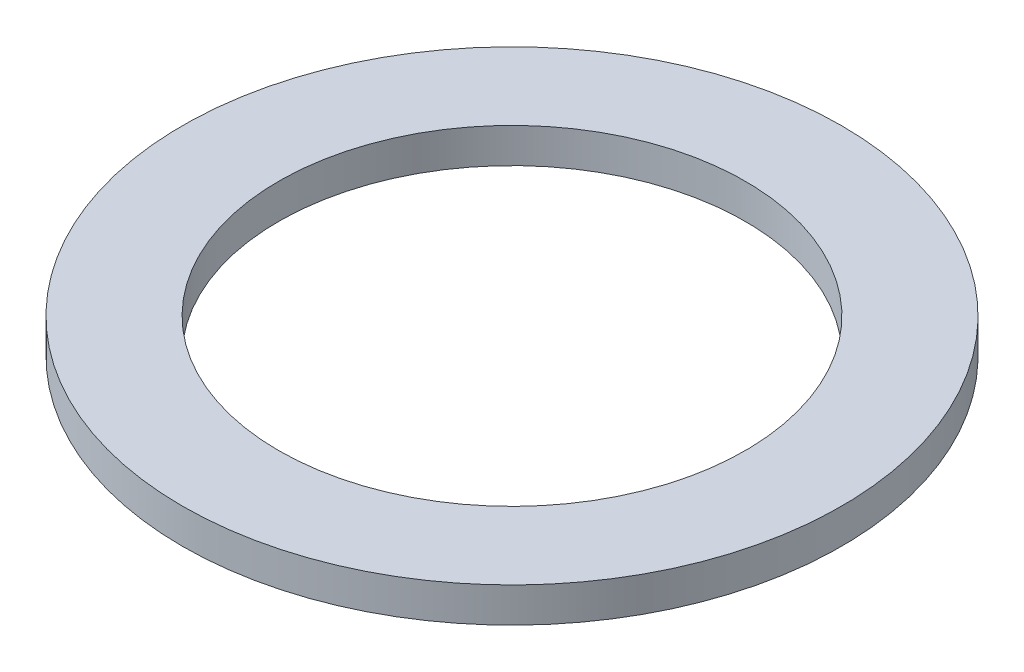
ISO-10303-21;
HEADER;
FILE_DESCRIPTION(('STEP AP214'),'2;1');
FILE_NAME('part.step','',(''),(''),'','','');
FILE_SCHEMA(('AUTOMOTIVE_DESIGN { 1 0 10303 214 1 1 1 1 }'));
ENDSEC;
DATA;
#1=APPLICATION_CONTEXT('core data for automotive mechanical design processes');
#2=APPLICATION_PROTOCOL_DEFINITION('international standard','automotive_design',2000,#1);
#3=PRODUCT_CONTEXT('',#1,'mechanical');
#4=PRODUCT('Part','Part','',(#3));
#5=PRODUCT_RELATED_PRODUCT_CATEGORY('part','',(#4));
#6=PRODUCT_DEFINITION_FORMATION('','',#4);
#7=PRODUCT_DEFINITION_CONTEXT('part definition',#1,'design');
#8=PRODUCT_DEFINITION('design','',#6,#7);
#9=PRODUCT_DEFINITION_SHAPE('','',#8);
#10=(LENGTH_UNIT() NAMED_UNIT(*) SI_UNIT(.MILLI.,.METRE.));
#11=(NAMED_UNIT(*) PLANE_ANGLE_UNIT() SI_UNIT($,.RADIAN.));
#12=(NAMED_UNIT(*) SI_UNIT($,.STERADIAN.) SOLID_ANGLE_UNIT());
#13=UNCERTAINTY_MEASURE_WITH_UNIT(LENGTH_MEASURE(1.E-05),#10,'distance_accuracy_value','');
#14=(GEOMETRIC_REPRESENTATION_CONTEXT(3) GLOBAL_UNCERTAINTY_ASSIGNED_CONTEXT((#13)) GLOBAL_UNIT_ASSIGNED_CONTEXT((#10,
#11,#12)) REPRESENTATION_CONTEXT('',''));
#15=CARTESIAN_POINT('',(0.,0.,0.));
#16=DIRECTION('',(0.,0.,1.));
#17=DIRECTION('',(1.,0.,0.));
#18=AXIS2_PLACEMENT_3D('',#15,#16,#17);
#19=CARTESIAN_POINT('',(0.,-2.325,0.));
#20=DIRECTION('',(0.,1.,0.));
#21=DIRECTION('',(0.,0.,1.));
#22=AXIS2_PLACEMENT_3D('',#19,#20,#21);
#23=CYLINDRICAL_SURFACE('',#22,22.);
#24=CARTESIAN_POINT('',(0.,-2.325,0.));
#25=DIRECTION('',(0.,1.,0.));
#26=DIRECTION('',(0.,0.,1.));
#27=AXIS2_PLACEMENT_3D('',#24,#25,#26);
#28=CIRCLE('',#27,22.);
#29=CARTESIAN_POINT('',(0.,-2.325,22.));
#30=VERTEX_POINT('',#29);
#31=EDGE_CURVE('E10',#30,#30,#28,.T.);
#32=ORIENTED_EDGE('',*,*,#31,.T.);
#33=EDGE_LOOP('',(#32));
#34=FACE_BOUND('',#33,.T.);
#35=CARTESIAN_POINT('',(0.,0.,0.));
#36=DIRECTION('',(0.,1.,0.));
#37=DIRECTION('',(0.,0.,1.));
#38=AXIS2_PLACEMENT_3D('',#35,#36,#37);
#39=CIRCLE('',#38,22.);
#40=CARTESIAN_POINT('',(0.,0.,22.));
#41=VERTEX_POINT('',#40);
#42=EDGE_CURVE('E38',#41,#41,#39,.T.);
#43=ORIENTED_EDGE('',*,*,#42,.F.);
#44=EDGE_LOOP('',(#43));
#45=FACE_BOUND('',#44,.T.);
#46=ADVANCED_FACE('F35',(#34,#45),#23,.T.);
#47=CARTESIAN_POINT('',(0.,-2.325,0.));
#48=DIRECTION('',(0.,1.,0.));
#49=DIRECTION('',(0.,0.,1.));
#50=AXIS2_PLACEMENT_3D('',#47,#48,#49);
#51=PLANE('',#50);
#52=CARTESIAN_POINT('',(0.,-2.325,0.));
#53=DIRECTION('',(0.,1.,0.));
#54=DIRECTION('',(0.,0.,1.));
#55=AXIS2_PLACEMENT_3D('',#52,#53,#54);
#56=CIRCLE('',#55,15.575);
#57=CARTESIAN_POINT('',(0.,-2.325,15.575));
#58=VERTEX_POINT('',#57);
#59=EDGE_CURVE('E45',#58,#58,#56,.T.);
#60=ORIENTED_EDGE('',*,*,#59,.T.);
#61=EDGE_LOOP('',(#60));
#62=FACE_BOUND('',#61,.T.);
#63=ORIENTED_EDGE('',*,*,#31,.F.);
#64=EDGE_LOOP('',(#63));
#65=FACE_BOUND('',#64,.T.);
#66=ADVANCED_FACE('F53',(#62,#65),#51,.F.);
#67=CARTESIAN_POINT('',(0.,0.,0.));
#68=DIRECTION('',(0.,1.,0.));
#69=DIRECTION('',(0.,0.,1.));
#70=AXIS2_PLACEMENT_3D('',#67,#68,#69);
#71=PLANE('',#70);
#72=CARTESIAN_POINT('',(0.,0.,0.));
#73=DIRECTION('',(0.,1.,0.));
#74=DIRECTION('',(0.,0.,1.));
#75=AXIS2_PLACEMENT_3D('',#72,#73,#74);
#76=CIRCLE('',#75,15.575);
#77=CARTESIAN_POINT('',(0.,0.,15.575));
#78=VERTEX_POINT('',#77);
#79=EDGE_CURVE('E47',#78,#78,#76,.T.);
#80=ORIENTED_EDGE('',*,*,#79,.F.);
#81=EDGE_LOOP('',(#80));
#82=FACE_BOUND('',#81,.T.);
#83=ORIENTED_EDGE('',*,*,#42,.T.);
#84=EDGE_LOOP('',(#83));
#85=FACE_BOUND('',#84,.T.);
#86=ADVANCED_FACE('F59',(#82,#85),#71,.T.);
#87=CARTESIAN_POINT('',(0.,-2.325,0.));
#88=DIRECTION('',(0.,1.,0.));
#89=DIRECTION('',(0.,0.,1.));
#90=AXIS2_PLACEMENT_3D('',#87,#88,#89);
#91=CYLINDRICAL_SURFACE('',#90,15.575);
#92=ORIENTED_EDGE('',*,*,#59,.F.);
#93=EDGE_LOOP('',(#92));
#94=FACE_BOUND('',#93,.T.);
#95=ORIENTED_EDGE('',*,*,#79,.T.);
#96=EDGE_LOOP('',(#95));
#97=FACE_BOUND('',#96,.T.);
#98=ADVANCED_FACE('F56',(#94,#97),#91,.F.);
#99=CLOSED_SHELL('',(#46,#66,#86,#98));
#100=MANIFOLD_SOLID_BREP('B2',#99);
#101=ADVANCED_BREP_SHAPE_REPRESENTATION('',(#18,#100),#14);
#102=SHAPE_DEFINITION_REPRESENTATION(#9,#101);
ENDSEC;
END-ISO-10303-21;
